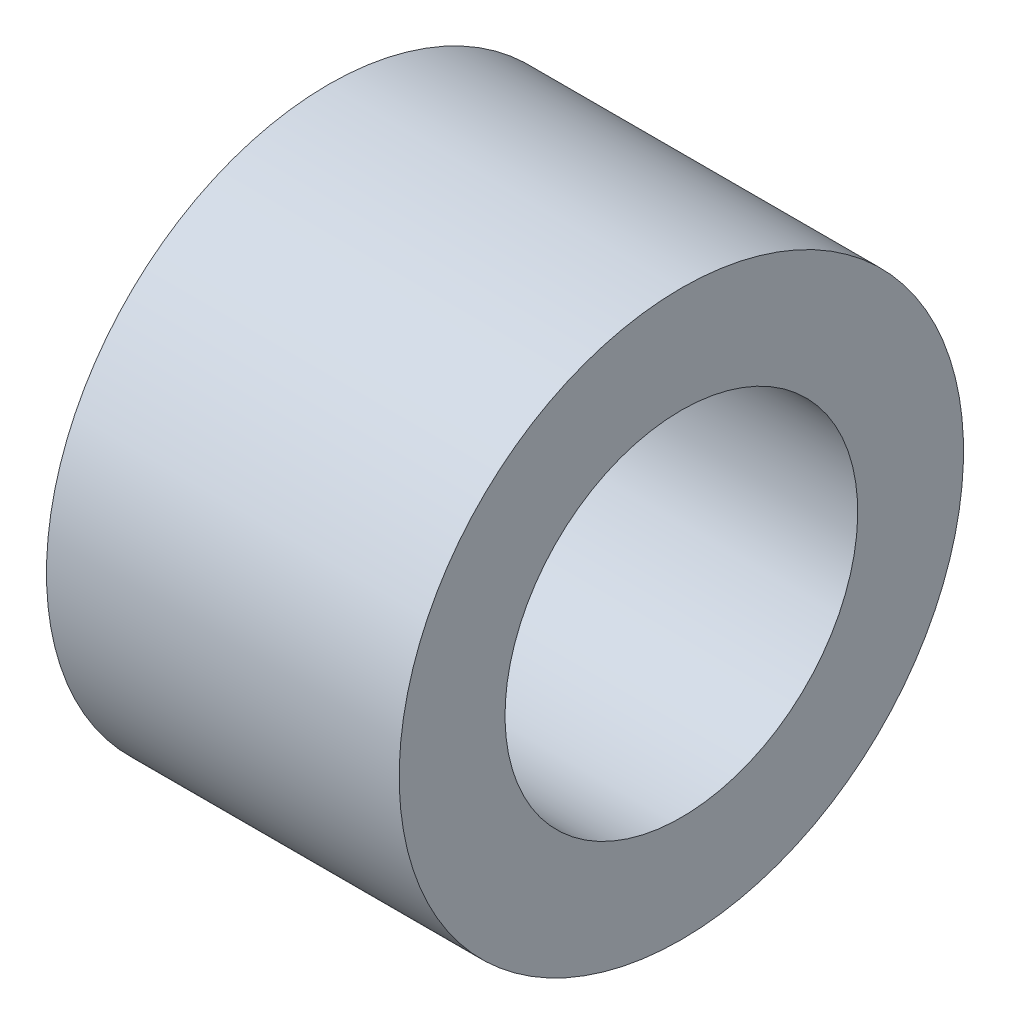
ISO-10303-21;
HEADER;
FILE_DESCRIPTION(('STEP AP214'),'2;1');
FILE_NAME('part.step','',(''),(''),'','','');
FILE_SCHEMA(('AUTOMOTIVE_DESIGN { 1 0 10303 214 1 1 1 1 }'));
ENDSEC;
DATA;
#1=APPLICATION_CONTEXT('core data for automotive mechanical design processes');
#2=APPLICATION_PROTOCOL_DEFINITION('international standard','automotive_design',2000,#1);
#3=PRODUCT_CONTEXT('',#1,'mechanical');
#4=PRODUCT('Part','Part','',(#3));
#5=PRODUCT_RELATED_PRODUCT_CATEGORY('part','',(#4));
#6=PRODUCT_DEFINITION_FORMATION('','',#4);
#7=PRODUCT_DEFINITION_CONTEXT('part definition',#1,'design');
#8=PRODUCT_DEFINITION('design','',#6,#7);
#9=PRODUCT_DEFINITION_SHAPE('','',#8);
#10=(LENGTH_UNIT() NAMED_UNIT(*) SI_UNIT(.MILLI.,.METRE.));
#11=(NAMED_UNIT(*) PLANE_ANGLE_UNIT() SI_UNIT($,.RADIAN.));
#12=(NAMED_UNIT(*) SI_UNIT($,.STERADIAN.) SOLID_ANGLE_UNIT());
#13=UNCERTAINTY_MEASURE_WITH_UNIT(LENGTH_MEASURE(1.E-05),#10,'distance_accuracy_value','');
#14=(GEOMETRIC_REPRESENTATION_CONTEXT(3) GLOBAL_UNCERTAINTY_ASSIGNED_CONTEXT((#13)) GLOBAL_UNIT_ASSIGNED_CONTEXT((#10,
#11,#12)) REPRESENTATION_CONTEXT('',''));
#15=CARTESIAN_POINT('',(0.,0.,0.));
#16=DIRECTION('',(0.,0.,1.));
#17=DIRECTION('',(1.,0.,0.));
#18=AXIS2_PLACEMENT_3D('',#15,#16,#17);
#19=CARTESIAN_POINT('',(25.,0.,0.));
#20=DIRECTION('',(1.,0.,0.));
#21=DIRECTION('',(0.,1.,0.));
#22=AXIS2_PLACEMENT_3D('',#19,#20,#21);
#23=PLANE('',#22);
#24=CARTESIAN_POINT('',(25.,0.,0.));
#25=DIRECTION('',(1.,0.,0.));
#26=DIRECTION('',(0.,-1.,0.));
#27=AXIS2_PLACEMENT_3D('',#24,#25,#26);
#28=CIRCLE('',#27,20.);
#29=CARTESIAN_POINT('',(25.,20.,0.));
#30=VERTEX_POINT('',#29);
#31=EDGE_CURVE('E27',#30,#30,#28,.T.);
#32=ORIENTED_EDGE('',*,*,#31,.T.);
#33=EDGE_LOOP('',(#32));
#34=FACE_BOUND('',#33,.T.);
#35=CARTESIAN_POINT('',(25.,0.,0.));
#36=DIRECTION('',(-1.,0.,0.));
#37=DIRECTION('',(0.,-1.,0.));
#38=AXIS2_PLACEMENT_3D('',#35,#36,#37);
#39=CIRCLE('',#38,12.5);
#40=CARTESIAN_POINT('',(25.,12.5,0.));
#41=VERTEX_POINT('',#40);
#42=EDGE_CURVE('E20',#41,#41,#39,.T.);
#43=ORIENTED_EDGE('',*,*,#42,.T.);
#44=EDGE_LOOP('',(#43));
#45=FACE_BOUND('',#44,.T.);
#46=ADVANCED_FACE('F16',(#34,#45),#23,.T.);
#47=CARTESIAN_POINT('',(0.,0.,0.));
#48=DIRECTION('',(1.,0.,0.));
#49=DIRECTION('',(0.,1.,0.));
#50=AXIS2_PLACEMENT_3D('',#47,#48,#49);
#51=PLANE('',#50);
#52=CARTESIAN_POINT('',(0.,0.,0.));
#53=DIRECTION('',(-1.,0.,0.));
#54=DIRECTION('',(0.,-1.,0.));
#55=AXIS2_PLACEMENT_3D('',#52,#53,#54);
#56=CIRCLE('',#55,20.);
#57=CARTESIAN_POINT('',(0.,20.,0.));
#58=VERTEX_POINT('',#57);
#59=EDGE_CURVE('E11',#58,#58,#56,.T.);
#60=ORIENTED_EDGE('',*,*,#59,.T.);
#61=EDGE_LOOP('',(#60));
#62=FACE_BOUND('',#61,.T.);
#63=CARTESIAN_POINT('',(0.,0.,0.));
#64=DIRECTION('',(1.,0.,0.));
#65=DIRECTION('',(0.,-1.,0.));
#66=AXIS2_PLACEMENT_3D('',#63,#64,#65);
#67=CIRCLE('',#66,12.5);
#68=CARTESIAN_POINT('',(0.,12.5,0.));
#69=VERTEX_POINT('',#68);
#70=EDGE_CURVE('E51',#69,#69,#67,.T.);
#71=ORIENTED_EDGE('',*,*,#70,.T.);
#72=EDGE_LOOP('',(#71));
#73=FACE_BOUND('',#72,.T.);
#74=ADVANCED_FACE('F52',(#62,#73),#51,.F.);
#75=CARTESIAN_POINT('',(0.,0.,0.));
#76=DIRECTION('',(1.,0.,0.));
#77=DIRECTION('',(0.,-1.,0.));
#78=AXIS2_PLACEMENT_3D('',#75,#76,#77);
#79=CYLINDRICAL_SURFACE('',#78,20.);
#80=ORIENTED_EDGE('',*,*,#59,.F.);
#81=EDGE_LOOP('',(#80));
#82=FACE_BOUND('',#81,.T.);
#83=ORIENTED_EDGE('',*,*,#31,.F.);
#84=EDGE_LOOP('',(#83));
#85=FACE_BOUND('',#84,.T.);
#86=ADVANCED_FACE('F84',(#82,#85),#79,.T.);
#87=CARTESIAN_POINT('',(0.,0.,0.));
#88=DIRECTION('',(1.,0.,0.));
#89=DIRECTION('',(0.,-1.,0.));
#90=AXIS2_PLACEMENT_3D('',#87,#88,#89);
#91=CYLINDRICAL_SURFACE('',#90,12.5);
#92=ORIENTED_EDGE('',*,*,#70,.F.);
#93=EDGE_LOOP('',(#92));
#94=FACE_BOUND('',#93,.T.);
#95=ORIENTED_EDGE('',*,*,#42,.F.);
#96=EDGE_LOOP('',(#95));
#97=FACE_BOUND('',#96,.T.);
#98=ADVANCED_FACE('F18',(#94,#97),#91,.F.);
#99=CLOSED_SHELL('',(#46,#74,#86,#98));
#100=MANIFOLD_SOLID_BREP('B1',#99);
#101=ADVANCED_BREP_SHAPE_REPRESENTATION('',(#18,#100),#14);
#102=SHAPE_DEFINITION_REPRESENTATION(#9,#101);
ENDSEC;
END-ISO-10303-21;
